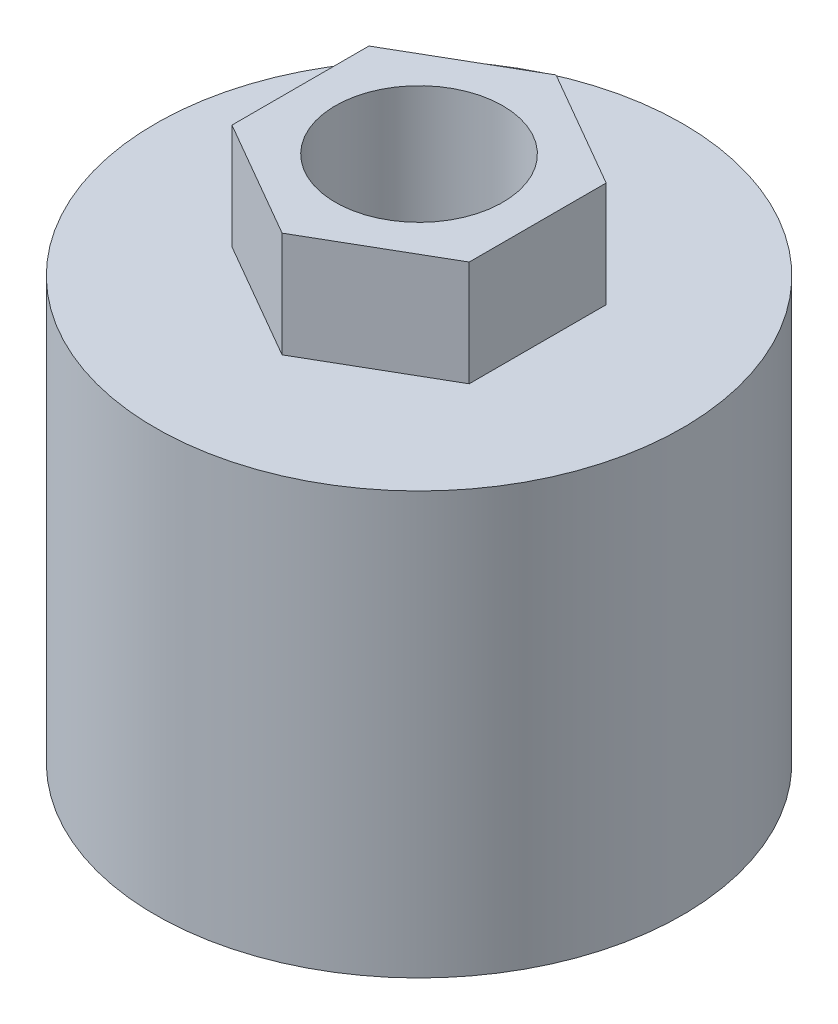
ISO-10303-21;
HEADER;
FILE_DESCRIPTION(('STEP AP214'),'2;1');
FILE_NAME('part.step','',(''),(''),'','','');
FILE_SCHEMA(('AUTOMOTIVE_DESIGN { 1 0 10303 214 1 1 1 1 }'));
ENDSEC;
DATA;
#1=APPLICATION_CONTEXT('core data for automotive mechanical design processes');
#2=APPLICATION_PROTOCOL_DEFINITION('international standard','automotive_design',2000,#1);
#3=PRODUCT_CONTEXT('',#1,'mechanical');
#4=PRODUCT('Part','Part','',(#3));
#5=PRODUCT_RELATED_PRODUCT_CATEGORY('part','',(#4));
#6=PRODUCT_DEFINITION_FORMATION('','',#4);
#7=PRODUCT_DEFINITION_CONTEXT('part definition',#1,'design');
#8=PRODUCT_DEFINITION('design','',#6,#7);
#9=PRODUCT_DEFINITION_SHAPE('','',#8);
#10=(LENGTH_UNIT() NAMED_UNIT(*) SI_UNIT(.MILLI.,.METRE.));
#11=(NAMED_UNIT(*) PLANE_ANGLE_UNIT() SI_UNIT($,.RADIAN.));
#12=(NAMED_UNIT(*) SI_UNIT($,.STERADIAN.) SOLID_ANGLE_UNIT());
#13=UNCERTAINTY_MEASURE_WITH_UNIT(LENGTH_MEASURE(1.E-05),#10,'distance_accuracy_value','');
#14=(GEOMETRIC_REPRESENTATION_CONTEXT(3) GLOBAL_UNCERTAINTY_ASSIGNED_CONTEXT((#13)) GLOBAL_UNIT_ASSIGNED_CONTEXT((#10,
#11,#12)) REPRESENTATION_CONTEXT('',''));
#15=CARTESIAN_POINT('',(0.,0.,0.));
#16=DIRECTION('',(0.,0.,1.));
#17=DIRECTION('',(1.,0.,0.));
#18=AXIS2_PLACEMENT_3D('',#15,#16,#17);
#19=CARTESIAN_POINT('',(5.0419,25.4,0.));
#20=DIRECTION('',(0.,1.,0.));
#21=DIRECTION('',(0.,0.,1.));
#22=AXIS2_PLACEMENT_3D('',#19,#20,#21);
#23=PLANE('',#22);
#24=CARTESIAN_POINT('',(0.,25.4,0.));
#25=DIRECTION('',(0.,-1.,0.));
#26=DIRECTION('',(0.,0.,-1.));
#27=AXIS2_PLACEMENT_3D('',#24,#25,#26);
#28=CIRCLE('',#27,15.875);
#29=CARTESIAN_POINT('',(0.,25.4,-15.875));
#30=VERTEX_POINT('',#29);
#31=EDGE_CURVE('E43',#30,#30,#28,.T.);
#32=ORIENTED_EDGE('',*,*,#31,.F.);
#33=EDGE_LOOP('',(#32));
#34=FACE_BOUND('',#33,.T.);
#35=DIRECTION('',(-0.866025403784439,0.,0.5));
#36=VECTOR('',#35,1.);
#37=CARTESIAN_POINT('',(0.,25.4,-8.24889197104678));
#38=LINE('',#37,#36);
#39=CARTESIAN_POINT('',(0.,25.4,-8.24889197104678));
#40=VERTEX_POINT('',#39);
#41=CARTESIAN_POINT('',(-7.14375,25.4,-4.12444598552339));
#42=VERTEX_POINT('',#41);
#43=EDGE_CURVE('E292',#40,#42,#38,.T.);
#44=ORIENTED_EDGE('',*,*,#43,.F.);
#45=DIRECTION('',(-0.866025403784439,0.,-0.5));
#46=VECTOR('',#45,1.);
#47=CARTESIAN_POINT('',(7.14375,25.4,-4.12444598552339));
#48=LINE('',#47,#46);
#49=CARTESIAN_POINT('',(7.14375,25.4,-4.12444598552339));
#50=VERTEX_POINT('',#49);
#51=EDGE_CURVE('E147',#50,#40,#48,.T.);
#52=ORIENTED_EDGE('',*,*,#51,.F.);
#53=DIRECTION('',(0.,0.,-1.));
#54=VECTOR('',#53,1.);
#55=CARTESIAN_POINT('',(7.14375,25.4,4.12444598552339));
#56=LINE('',#55,#54);
#57=CARTESIAN_POINT('',(7.14375,25.4,4.12444598552339));
#58=VERTEX_POINT('',#57);
#59=EDGE_CURVE('E143',#58,#50,#56,.T.);
#60=ORIENTED_EDGE('',*,*,#59,.F.);
#61=DIRECTION('',(0.866025403784439,0.,-0.5));
#62=VECTOR('',#61,1.);
#63=CARTESIAN_POINT('',(0.,25.4,8.24889197104678));
#64=LINE('',#63,#62);
#65=CARTESIAN_POINT('',(0.,25.4,8.24889197104678));
#66=VERTEX_POINT('',#65);
#67=EDGE_CURVE('E307',#66,#58,#64,.T.);
#68=ORIENTED_EDGE('',*,*,#67,.F.);
#69=DIRECTION('',(0.866025403784439,0.,0.5));
#70=VECTOR('',#69,1.);
#71=CARTESIAN_POINT('',(-7.14375,25.4,4.12444598552339));
#72=LINE('',#71,#70);
#73=CARTESIAN_POINT('',(-7.14375,25.4,4.12444598552339));
#74=VERTEX_POINT('',#73);
#75=EDGE_CURVE('E305',#74,#66,#72,.T.);
#76=ORIENTED_EDGE('',*,*,#75,.F.);
#77=DIRECTION('',(0.,0.,1.));
#78=VECTOR('',#77,1.);
#79=CARTESIAN_POINT('',(-7.14375,25.4,-4.12444598552339));
#80=LINE('',#79,#78);
#81=EDGE_CURVE('E303',#42,#74,#80,.T.);
#82=ORIENTED_EDGE('',*,*,#81,.F.);
#83=EDGE_LOOP('',(#44,#52,#60,#68,#76,#82));
#84=FACE_BOUND('',#83,.T.);
#85=ADVANCED_FACE('F34',(#34,#84),#23,.T.);
#86=CARTESIAN_POINT('',(0.,0.,0.));
#87=DIRECTION('',(0.,-1.,0.));
#88=DIRECTION('',(0.,0.,-1.));
#89=AXIS2_PLACEMENT_3D('',#86,#87,#88);
#90=CYLINDRICAL_SURFACE('',#89,5.0419);
#91=CARTESIAN_POINT('',(0.,9.525,0.));
#92=DIRECTION('',(0.,-1.,0.));
#93=DIRECTION('',(0.,0.,-1.));
#94=AXIS2_PLACEMENT_3D('',#91,#92,#93);
#95=CIRCLE('',#94,5.0419);
#96=CARTESIAN_POINT('',(0.,9.525,-5.0419));
#97=VERTEX_POINT('',#96);
#98=EDGE_CURVE('E38',#97,#97,#95,.T.);
#99=ORIENTED_EDGE('',*,*,#98,.T.);
#100=EDGE_LOOP('',(#99));
#101=FACE_BOUND('',#100,.T.);
#102=CARTESIAN_POINT('',(0.,31.75,0.));
#103=DIRECTION('',(0.,-1.,0.));
#104=DIRECTION('',(0.,0.,-1.));
#105=AXIS2_PLACEMENT_3D('',#102,#103,#104);
#106=CIRCLE('',#105,5.0419);
#107=CARTESIAN_POINT('',(0.,31.75,-5.0419));
#108=VERTEX_POINT('',#107);
#109=EDGE_CURVE('E290',#108,#108,#106,.T.);
#110=ORIENTED_EDGE('',*,*,#109,.F.);
#111=EDGE_LOOP('',(#110));
#112=FACE_BOUND('',#111,.T.);
#113=ADVANCED_FACE('F206',(#101,#112),#90,.F.);
#114=CARTESIAN_POINT('',(5.0419,0.,0.));
#115=DIRECTION('',(0.,-1.,0.));
#116=DIRECTION('',(0.,0.,-1.));
#117=AXIS2_PLACEMENT_3D('',#114,#115,#116);
#118=PLANE('',#117);
#119=DIRECTION('',(0.866025403784439,0.,0.5));
#120=VECTOR('',#119,1.);
#121=CARTESIAN_POINT('',(0.,0.,-8.79881810244989));
#122=LINE('',#121,#120);
#123=CARTESIAN_POINT('',(0.,0.,-8.79881810244989));
#124=VERTEX_POINT('',#123);
#125=CARTESIAN_POINT('',(7.62,0.,-4.39940905122495));
#126=VERTEX_POINT('',#125);
#127=EDGE_CURVE('E58',#124,#126,#122,.T.);
#128=ORIENTED_EDGE('',*,*,#127,.F.);
#129=DIRECTION('',(0.866025403784439,0.,-0.5));
#130=VECTOR('',#129,1.);
#131=CARTESIAN_POINT('',(-7.62,0.,-4.39940905122495));
#132=LINE('',#131,#130);
#133=CARTESIAN_POINT('',(-7.62,0.,-4.39940905122495));
#134=VERTEX_POINT('',#133);
#135=EDGE_CURVE('E160',#134,#124,#132,.T.);
#136=ORIENTED_EDGE('',*,*,#135,.F.);
#137=DIRECTION('',(0.,0.,-1.));
#138=VECTOR('',#137,1.);
#139=CARTESIAN_POINT('',(-7.62,0.,4.39940905122495));
#140=LINE('',#139,#138);
#141=CARTESIAN_POINT('',(-7.62,0.,4.39940905122495));
#142=VERTEX_POINT('',#141);
#143=EDGE_CURVE('E184',#142,#134,#140,.T.);
#144=ORIENTED_EDGE('',*,*,#143,.F.);
#145=DIRECTION('',(-0.866025403784439,0.,-0.5));
#146=VECTOR('',#145,1.);
#147=CARTESIAN_POINT('',(0.,0.,8.79881810244989));
#148=LINE('',#147,#146);
#149=CARTESIAN_POINT('',(0.,0.,8.79881810244989));
#150=VERTEX_POINT('',#149);
#151=EDGE_CURVE('E181',#150,#142,#148,.T.);
#152=ORIENTED_EDGE('',*,*,#151,.F.);
#153=DIRECTION('',(-0.866025403784439,0.,0.5));
#154=VECTOR('',#153,1.);
#155=CARTESIAN_POINT('',(7.62,0.,4.39940905122495));
#156=LINE('',#155,#154);
#157=CARTESIAN_POINT('',(7.62,0.,4.39940905122495));
#158=VERTEX_POINT('',#157);
#159=EDGE_CURVE('E178',#158,#150,#156,.T.);
#160=ORIENTED_EDGE('',*,*,#159,.F.);
#161=DIRECTION('',(0.,0.,1.));
#162=VECTOR('',#161,1.);
#163=CARTESIAN_POINT('',(7.62,0.,-4.39940905122495));
#164=LINE('',#163,#162);
#165=EDGE_CURVE('E150',#126,#158,#164,.T.);
#166=ORIENTED_EDGE('',*,*,#165,.F.);
#167=EDGE_LOOP('',(#128,#136,#144,#152,#160,#166));
#168=FACE_BOUND('',#167,.T.);
#169=CARTESIAN_POINT('',(0.,0.,0.));
#170=DIRECTION('',(0.,-1.,0.));
#171=DIRECTION('',(0.,0.,-1.));
#172=AXIS2_PLACEMENT_3D('',#169,#170,#171);
#173=CIRCLE('',#172,15.875);
#174=CARTESIAN_POINT('',(0.,0.,-15.875));
#175=VERTEX_POINT('',#174);
#176=EDGE_CURVE('E11',#175,#175,#173,.T.);
#177=ORIENTED_EDGE('',*,*,#176,.T.);
#178=EDGE_LOOP('',(#177));
#179=FACE_BOUND('',#178,.T.);
#180=ADVANCED_FACE('F36',(#168,#179),#118,.T.);
#181=CARTESIAN_POINT('',(0.,0.,0.));
#182=DIRECTION('',(0.,-1.,0.));
#183=DIRECTION('',(0.,0.,-1.));
#184=AXIS2_PLACEMENT_3D('',#181,#182,#183);
#185=CYLINDRICAL_SURFACE('',#184,15.875);
#186=ORIENTED_EDGE('',*,*,#31,.T.);
#187=EDGE_LOOP('',(#186));
#188=FACE_BOUND('',#187,.T.);
#189=ORIENTED_EDGE('',*,*,#176,.F.);
#190=EDGE_LOOP('',(#189));
#191=FACE_BOUND('',#190,.T.);
#192=ADVANCED_FACE('F238',(#188,#191),#185,.T.);
#193=CARTESIAN_POINT('',(0.,9.525,-8.79881810244989));
#194=DIRECTION('',(0.5,0.,-0.866025403784439));
#195=DIRECTION('',(-0.866025403784439,0.,-0.5));
#196=AXIS2_PLACEMENT_3D('',#193,#194,#195);
#197=PLANE('',#196);
#198=ORIENTED_EDGE('',*,*,#127,.T.);
#199=DIRECTION('',(0.,-1.,0.));
#200=VECTOR('',#199,1.);
#201=CARTESIAN_POINT('',(7.62,9.525,-4.39940905122495));
#202=LINE('',#201,#200);
#203=CARTESIAN_POINT('',(7.62,9.525,-4.39940905122495));
#204=VERTEX_POINT('',#203);
#205=EDGE_CURVE('E174',#204,#126,#202,.T.);
#206=ORIENTED_EDGE('',*,*,#205,.F.);
#207=DIRECTION('',(0.866025403784439,0.,0.5));
#208=VECTOR('',#207,1.);
#209=CARTESIAN_POINT('',(0.,9.525,-8.79881810244989));
#210=LINE('',#209,#208);
#211=CARTESIAN_POINT('',(0.,9.525,-8.79881810244989));
#212=VERTEX_POINT('',#211);
#213=EDGE_CURVE('E156',#212,#204,#210,.T.);
#214=ORIENTED_EDGE('',*,*,#213,.F.);
#215=DIRECTION('',(0.,-1.,0.));
#216=VECTOR('',#215,1.);
#217=CARTESIAN_POINT('',(0.,9.525,-8.79881810244989));
#218=LINE('',#217,#216);
#219=EDGE_CURVE('E189',#212,#124,#218,.T.);
#220=ORIENTED_EDGE('',*,*,#219,.T.);
#221=EDGE_LOOP('',(#198,#206,#214,#220));
#222=FACE_BOUND('',#221,.T.);
#223=ADVANCED_FACE('F217',(#222),#197,.F.);
#224=CARTESIAN_POINT('',(-7.62,9.525,-4.39940905122495));
#225=DIRECTION('',(-0.5,0.,-0.866025403784439));
#226=DIRECTION('',(-0.866025403784438,0.,0.5));
#227=AXIS2_PLACEMENT_3D('',#224,#225,#226);
#228=PLANE('',#227);
#229=ORIENTED_EDGE('',*,*,#135,.T.);
#230=ORIENTED_EDGE('',*,*,#219,.F.);
#231=DIRECTION('',(0.866025403784439,0.,-0.5));
#232=VECTOR('',#231,1.);
#233=CARTESIAN_POINT('',(-7.62,9.525,-4.39940905122495));
#234=LINE('',#233,#232);
#235=CARTESIAN_POINT('',(-7.62,9.525,-4.39940905122495));
#236=VERTEX_POINT('',#235);
#237=EDGE_CURVE('E172',#236,#212,#234,.T.);
#238=ORIENTED_EDGE('',*,*,#237,.F.);
#239=DIRECTION('',(0.,-1.,0.));
#240=VECTOR('',#239,1.);
#241=CARTESIAN_POINT('',(-7.62,9.525,-4.39940905122495));
#242=LINE('',#241,#240);
#243=EDGE_CURVE('E191',#236,#134,#242,.T.);
#244=ORIENTED_EDGE('',*,*,#243,.T.);
#245=EDGE_LOOP('',(#229,#230,#238,#244));
#246=FACE_BOUND('',#245,.T.);
#247=ADVANCED_FACE('F234',(#246),#228,.F.);
#248=CARTESIAN_POINT('',(-7.62,9.525,4.39940905122495));
#249=DIRECTION('',(-1.,0.,0.));
#250=DIRECTION('',(0.,0.,1.));
#251=AXIS2_PLACEMENT_3D('',#248,#249,#250);
#252=PLANE('',#251);
#253=ORIENTED_EDGE('',*,*,#143,.T.);
#254=ORIENTED_EDGE('',*,*,#243,.F.);
#255=DIRECTION('',(0.,0.,-1.));
#256=VECTOR('',#255,1.);
#257=CARTESIAN_POINT('',(-7.62,9.525,4.39940905122495));
#258=LINE('',#257,#256);
#259=CARTESIAN_POINT('',(-7.62,9.525,4.39940905122495));
#260=VERTEX_POINT('',#259);
#261=EDGE_CURVE('E169',#260,#236,#258,.T.);
#262=ORIENTED_EDGE('',*,*,#261,.F.);
#263=DIRECTION('',(0.,-1.,0.));
#264=VECTOR('',#263,1.);
#265=CARTESIAN_POINT('',(-7.62,9.525,4.39940905122495));
#266=LINE('',#265,#264);
#267=EDGE_CURVE('E193',#260,#142,#266,.T.);
#268=ORIENTED_EDGE('',*,*,#267,.T.);
#269=EDGE_LOOP('',(#253,#254,#262,#268));
#270=FACE_BOUND('',#269,.T.);
#271=ADVANCED_FACE('F231',(#270),#252,.F.);
#272=CARTESIAN_POINT('',(0.,9.525,8.79881810244989));
#273=DIRECTION('',(-0.5,0.,0.866025403784439));
#274=DIRECTION('',(0.866025403784439,0.,0.5));
#275=AXIS2_PLACEMENT_3D('',#272,#273,#274);
#276=PLANE('',#275);
#277=ORIENTED_EDGE('',*,*,#151,.T.);
#278=ORIENTED_EDGE('',*,*,#267,.F.);
#279=DIRECTION('',(-0.866025403784439,0.,-0.5));
#280=VECTOR('',#279,1.);
#281=CARTESIAN_POINT('',(0.,9.525,8.79881810244989));
#282=LINE('',#281,#280);
#283=CARTESIAN_POINT('',(0.,9.525,8.79881810244989));
#284=VERTEX_POINT('',#283);
#285=EDGE_CURVE('E166',#284,#260,#282,.T.);
#286=ORIENTED_EDGE('',*,*,#285,.F.);
#287=DIRECTION('',(0.,-1.,0.));
#288=VECTOR('',#287,1.);
#289=CARTESIAN_POINT('',(0.,9.525,8.79881810244989));
#290=LINE('',#289,#288);
#291=EDGE_CURVE('E195',#284,#150,#290,.T.);
#292=ORIENTED_EDGE('',*,*,#291,.T.);
#293=EDGE_LOOP('',(#277,#278,#286,#292));
#294=FACE_BOUND('',#293,.T.);
#295=ADVANCED_FACE('F227',(#294),#276,.F.);
#296=CARTESIAN_POINT('',(7.62,9.525,4.39940905122495));
#297=DIRECTION('',(0.5,0.,0.866025403784439));
#298=DIRECTION('',(0.866025403784439,0.,-0.5));
#299=AXIS2_PLACEMENT_3D('',#296,#297,#298);
#300=PLANE('',#299);
#301=ORIENTED_EDGE('',*,*,#159,.T.);
#302=ORIENTED_EDGE('',*,*,#291,.F.);
#303=DIRECTION('',(-0.866025403784439,0.,0.5));
#304=VECTOR('',#303,1.);
#305=CARTESIAN_POINT('',(7.62,9.525,4.39940905122495));
#306=LINE('',#305,#304);
#307=CARTESIAN_POINT('',(7.62,9.525,4.39940905122495));
#308=VERTEX_POINT('',#307);
#309=EDGE_CURVE('E163',#308,#284,#306,.T.);
#310=ORIENTED_EDGE('',*,*,#309,.F.);
#311=DIRECTION('',(0.,-1.,0.));
#312=VECTOR('',#311,1.);
#313=CARTESIAN_POINT('',(7.62,9.525,4.39940905122495));
#314=LINE('',#313,#312);
#315=EDGE_CURVE('E197',#308,#158,#314,.T.);
#316=ORIENTED_EDGE('',*,*,#315,.T.);
#317=EDGE_LOOP('',(#301,#302,#310,#316));
#318=FACE_BOUND('',#317,.T.);
#319=ADVANCED_FACE('F223',(#318),#300,.F.);
#320=CARTESIAN_POINT('',(7.62,9.525,-4.39940905122495));
#321=DIRECTION('',(1.,0.,0.));
#322=DIRECTION('',(0.,0.,-1.));
#323=AXIS2_PLACEMENT_3D('',#320,#321,#322);
#324=PLANE('',#323);
#325=ORIENTED_EDGE('',*,*,#165,.T.);
#326=ORIENTED_EDGE('',*,*,#315,.F.);
#327=DIRECTION('',(0.,0.,1.));
#328=VECTOR('',#327,1.);
#329=CARTESIAN_POINT('',(7.62,9.525,-4.39940905122495));
#330=LINE('',#329,#328);
#331=EDGE_CURVE('E159',#204,#308,#330,.T.);
#332=ORIENTED_EDGE('',*,*,#331,.F.);
#333=ORIENTED_EDGE('',*,*,#205,.T.);
#334=EDGE_LOOP('',(#325,#326,#332,#333));
#335=FACE_BOUND('',#334,.T.);
#336=ADVANCED_FACE('F212',(#335),#324,.F.);
#337=CARTESIAN_POINT('',(0.,9.525,0.));
#338=DIRECTION('',(0.,-1.,0.));
#339=DIRECTION('',(0.,0.,-1.));
#340=AXIS2_PLACEMENT_3D('',#337,#338,#339);
#341=PLANE('',#340);
#342=ORIENTED_EDGE('',*,*,#98,.F.);
#343=EDGE_LOOP('',(#342));
#344=FACE_BOUND('',#343,.T.);
#345=ORIENTED_EDGE('',*,*,#213,.T.);
#346=ORIENTED_EDGE('',*,*,#331,.T.);
#347=ORIENTED_EDGE('',*,*,#309,.T.);
#348=ORIENTED_EDGE('',*,*,#285,.T.);
#349=ORIENTED_EDGE('',*,*,#261,.T.);
#350=ORIENTED_EDGE('',*,*,#237,.T.);
#351=EDGE_LOOP('',(#345,#346,#347,#348,#349,#350));
#352=FACE_BOUND('',#351,.T.);
#353=ADVANCED_FACE('F209',(#344,#352),#341,.T.);
#354=CARTESIAN_POINT('',(0.,31.75,0.));
#355=DIRECTION('',(0.,1.,0.));
#356=DIRECTION('',(0.,0.,1.));
#357=AXIS2_PLACEMENT_3D('',#354,#355,#356);
#358=PLANE('',#357);
#359=ORIENTED_EDGE('',*,*,#109,.T.);
#360=EDGE_LOOP('',(#359));
#361=FACE_BOUND('',#360,.T.);
#362=DIRECTION('',(-0.866025403784439,0.,-0.5));
#363=VECTOR('',#362,1.);
#364=CARTESIAN_POINT('',(7.14375,31.75,-4.12444598552339));
#365=LINE('',#364,#363);
#366=CARTESIAN_POINT('',(7.14375,31.75,-4.12444598552339));
#367=VERTEX_POINT('',#366);
#368=CARTESIAN_POINT('',(0.,31.75,-8.24889197104678));
#369=VERTEX_POINT('',#368);
#370=EDGE_CURVE('E135',#367,#369,#365,.T.);
#371=ORIENTED_EDGE('',*,*,#370,.T.);
#372=DIRECTION('',(-0.866025403784439,0.,0.5));
#373=VECTOR('',#372,1.);
#374=CARTESIAN_POINT('',(0.,31.75,-8.24889197104678));
#375=LINE('',#374,#373);
#376=CARTESIAN_POINT('',(-7.14375,31.75,-4.12444598552339));
#377=VERTEX_POINT('',#376);
#378=EDGE_CURVE('E124',#369,#377,#375,.T.);
#379=ORIENTED_EDGE('',*,*,#378,.T.);
#380=DIRECTION('',(0.,0.,1.));
#381=VECTOR('',#380,1.);
#382=CARTESIAN_POINT('',(-7.14375,31.75,-4.12444598552339));
#383=LINE('',#382,#381);
#384=CARTESIAN_POINT('',(-7.14375,31.75,4.12444598552339));
#385=VERTEX_POINT('',#384);
#386=EDGE_CURVE('E134',#377,#385,#383,.T.);
#387=ORIENTED_EDGE('',*,*,#386,.T.);
#388=DIRECTION('',(0.866025403784439,0.,0.5));
#389=VECTOR('',#388,1.);
#390=CARTESIAN_POINT('',(-7.14375,31.75,4.12444598552339));
#391=LINE('',#390,#389);
#392=CARTESIAN_POINT('',(0.,31.75,8.24889197104678));
#393=VERTEX_POINT('',#392);
#394=EDGE_CURVE('E296',#385,#393,#391,.T.);
#395=ORIENTED_EDGE('',*,*,#394,.T.);
#396=DIRECTION('',(0.866025403784439,0.,-0.5));
#397=VECTOR('',#396,1.);
#398=CARTESIAN_POINT('',(0.,31.75,8.24889197104678));
#399=LINE('',#398,#397);
#400=CARTESIAN_POINT('',(7.14375,31.75,4.12444598552339));
#401=VERTEX_POINT('',#400);
#402=EDGE_CURVE('E298',#393,#401,#399,.T.);
#403=ORIENTED_EDGE('',*,*,#402,.T.);
#404=DIRECTION('',(0.,0.,-1.));
#405=VECTOR('',#404,1.);
#406=CARTESIAN_POINT('',(7.14375,31.75,4.12444598552339));
#407=LINE('',#406,#405);
#408=EDGE_CURVE('E139',#401,#367,#407,.T.);
#409=ORIENTED_EDGE('',*,*,#408,.T.);
#410=EDGE_LOOP('',(#371,#379,#387,#395,#403,#409));
#411=FACE_BOUND('',#410,.T.);
#412=ADVANCED_FACE('F138',(#361,#411),#358,.T.);
#413=CARTESIAN_POINT('',(7.14375,31.75,4.12444598552339));
#414=DIRECTION('',(-1.,0.,0.));
#415=DIRECTION('',(0.,0.,1.));
#416=AXIS2_PLACEMENT_3D('',#413,#414,#415);
#417=PLANE('',#416);
#418=ORIENTED_EDGE('',*,*,#59,.T.);
#419=DIRECTION('',(0.,-1.,0.));
#420=VECTOR('',#419,1.);
#421=CARTESIAN_POINT('',(7.14375,31.75,-4.12444598552339));
#422=LINE('',#421,#420);
#423=EDGE_CURVE('E300',#367,#50,#422,.T.);
#424=ORIENTED_EDGE('',*,*,#423,.F.);
#425=ORIENTED_EDGE('',*,*,#408,.F.);
#426=DIRECTION('',(0.,-1.,0.));
#427=VECTOR('',#426,1.);
#428=CARTESIAN_POINT('',(7.14375,31.75,4.12444598552339));
#429=LINE('',#428,#427);
#430=EDGE_CURVE('E50',#401,#58,#429,.T.);
#431=ORIENTED_EDGE('',*,*,#430,.T.);
#432=EDGE_LOOP('',(#418,#424,#425,#431));
#433=FACE_BOUND('',#432,.T.);
#434=ADVANCED_FACE('F280',(#433),#417,.F.);
#435=CARTESIAN_POINT('',(0.,31.75,8.24889197104678));
#436=DIRECTION('',(-0.5,0.,-0.866025403784439));
#437=DIRECTION('',(-0.866025403784439,0.,0.5));
#438=AXIS2_PLACEMENT_3D('',#435,#436,#437);
#439=PLANE('',#438);
#440=ORIENTED_EDGE('',*,*,#67,.T.);
#441=ORIENTED_EDGE('',*,*,#430,.F.);
#442=ORIENTED_EDGE('',*,*,#402,.F.);
#443=DIRECTION('',(0.,-1.,0.));
#444=VECTOR('',#443,1.);
#445=CARTESIAN_POINT('',(0.,31.75,8.24889197104678));
#446=LINE('',#445,#444);
#447=EDGE_CURVE('E312',#393,#66,#446,.T.);
#448=ORIENTED_EDGE('',*,*,#447,.T.);
#449=EDGE_LOOP('',(#440,#441,#442,#448));
#450=FACE_BOUND('',#449,.T.);
#451=ADVANCED_FACE('F276',(#450),#439,.F.);
#452=CARTESIAN_POINT('',(-7.14375,31.75,4.12444598552339));
#453=DIRECTION('',(0.5,0.,-0.866025403784439));
#454=DIRECTION('',(-0.866025403784439,0.,-0.5));
#455=AXIS2_PLACEMENT_3D('',#452,#453,#454);
#456=PLANE('',#455);
#457=ORIENTED_EDGE('',*,*,#75,.T.);
#458=ORIENTED_EDGE('',*,*,#447,.F.);
#459=ORIENTED_EDGE('',*,*,#394,.F.);
#460=DIRECTION('',(0.,-1.,0.));
#461=VECTOR('',#460,1.);
#462=CARTESIAN_POINT('',(-7.14375,31.75,4.12444598552339));
#463=LINE('',#462,#461);
#464=EDGE_CURVE('E152',#385,#74,#463,.T.);
#465=ORIENTED_EDGE('',*,*,#464,.T.);
#466=EDGE_LOOP('',(#457,#458,#459,#465));
#467=FACE_BOUND('',#466,.T.);
#468=ADVANCED_FACE('F272',(#467),#456,.F.);
#469=CARTESIAN_POINT('',(-7.14375,31.75,-4.12444598552339));
#470=DIRECTION('',(1.,0.,0.));
#471=DIRECTION('',(0.,0.,-1.));
#472=AXIS2_PLACEMENT_3D('',#469,#470,#471);
#473=PLANE('',#472);
#474=ORIENTED_EDGE('',*,*,#81,.T.);
#475=ORIENTED_EDGE('',*,*,#464,.F.);
#476=ORIENTED_EDGE('',*,*,#386,.F.);
#477=DIRECTION('',(0.,-1.,0.));
#478=VECTOR('',#477,1.);
#479=CARTESIAN_POINT('',(-7.14375,31.75,-4.12444598552339));
#480=LINE('',#479,#478);
#481=EDGE_CURVE('E131',#377,#42,#480,.T.);
#482=ORIENTED_EDGE('',*,*,#481,.T.);
#483=EDGE_LOOP('',(#474,#475,#476,#482));
#484=FACE_BOUND('',#483,.T.);
#485=ADVANCED_FACE('F269',(#484),#473,.F.);
#486=CARTESIAN_POINT('',(0.,31.75,-8.24889197104678));
#487=DIRECTION('',(0.5,0.,0.866025403784439));
#488=DIRECTION('',(0.866025403784439,0.,-0.5));
#489=AXIS2_PLACEMENT_3D('',#486,#487,#488);
#490=PLANE('',#489);
#491=ORIENTED_EDGE('',*,*,#43,.T.);
#492=ORIENTED_EDGE('',*,*,#481,.F.);
#493=ORIENTED_EDGE('',*,*,#378,.F.);
#494=DIRECTION('',(0.,-1.,0.));
#495=VECTOR('',#494,1.);
#496=CARTESIAN_POINT('',(0.,31.75,-8.24889197104678));
#497=LINE('',#496,#495);
#498=EDGE_CURVE('E128',#369,#40,#497,.T.);
#499=ORIENTED_EDGE('',*,*,#498,.T.);
#500=EDGE_LOOP('',(#491,#492,#493,#499));
#501=FACE_BOUND('',#500,.T.);
#502=ADVANCED_FACE('F126',(#501),#490,.F.);
#503=CARTESIAN_POINT('',(7.14375,31.75,-4.12444598552339));
#504=DIRECTION('',(-0.5,0.,0.866025403784439));
#505=DIRECTION('',(0.866025403784439,0.,0.5));
#506=AXIS2_PLACEMENT_3D('',#503,#504,#505);
#507=PLANE('',#506);
#508=ORIENTED_EDGE('',*,*,#51,.T.);
#509=ORIENTED_EDGE('',*,*,#498,.F.);
#510=ORIENTED_EDGE('',*,*,#370,.F.);
#511=ORIENTED_EDGE('',*,*,#423,.T.);
#512=EDGE_LOOP('',(#508,#509,#510,#511));
#513=FACE_BOUND('',#512,.T.);
#514=ADVANCED_FACE('F145',(#513),#507,.F.);
#515=CLOSED_SHELL('',(#85,#113,#180,#192,#223,#247,#271,#295,#319,#336,#353,#412,#434,#451,#468,
#485,#502,#514));
#516=MANIFOLD_SOLID_BREP('B2',#515);
#517=ADVANCED_BREP_SHAPE_REPRESENTATION('',(#18,#516),#14);
#518=SHAPE_DEFINITION_REPRESENTATION(#9,#517);
ENDSEC;
END-ISO-10303-21;
